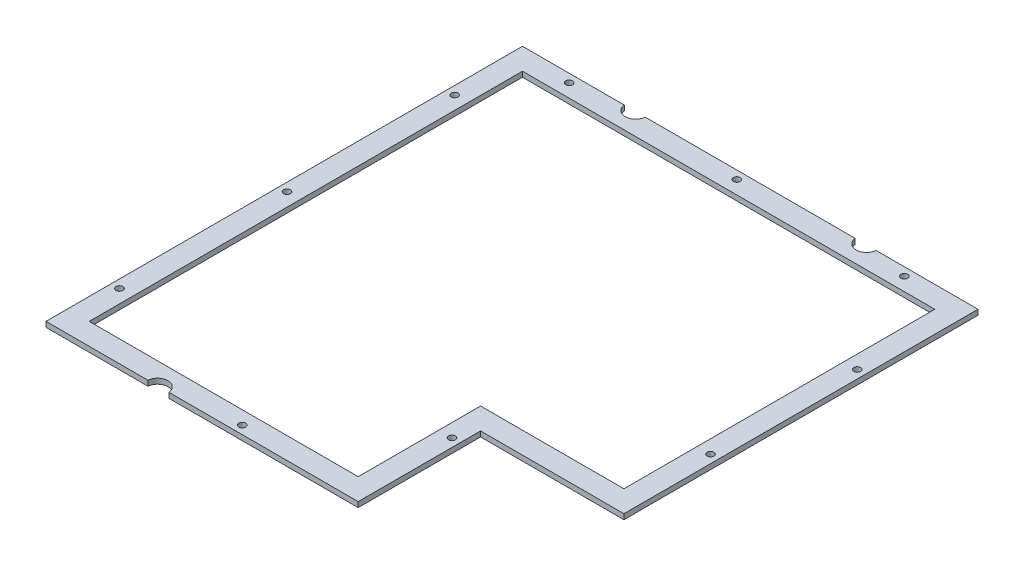
ISO-10303-21;
HEADER;
FILE_DESCRIPTION(('STEP AP214'),'2;1');
FILE_NAME('part.step','',(''),(''),'','','');
FILE_SCHEMA(('AUTOMOTIVE_DESIGN { 1 0 10303 214 1 1 1 1 }'));
ENDSEC;
DATA;
#1=APPLICATION_CONTEXT('core data for automotive mechanical design processes');
#2=APPLICATION_PROTOCOL_DEFINITION('international standard','automotive_design',2000,#1);
#3=PRODUCT_CONTEXT('',#1,'mechanical');
#4=PRODUCT('Part','Part','',(#3));
#5=PRODUCT_RELATED_PRODUCT_CATEGORY('part','',(#4));
#6=PRODUCT_DEFINITION_FORMATION('','',#4);
#7=PRODUCT_DEFINITION_CONTEXT('part definition',#1,'design');
#8=PRODUCT_DEFINITION('design','',#6,#7);
#9=PRODUCT_DEFINITION_SHAPE('','',#8);
#10=(LENGTH_UNIT() NAMED_UNIT(*) SI_UNIT(.MILLI.,.METRE.));
#11=(NAMED_UNIT(*) PLANE_ANGLE_UNIT() SI_UNIT($,.RADIAN.));
#12=(NAMED_UNIT(*) SI_UNIT($,.STERADIAN.) SOLID_ANGLE_UNIT());
#13=UNCERTAINTY_MEASURE_WITH_UNIT(LENGTH_MEASURE(1.E-05),#10,'distance_accuracy_value','');
#14=(GEOMETRIC_REPRESENTATION_CONTEXT(3) GLOBAL_UNCERTAINTY_ASSIGNED_CONTEXT((#13)) GLOBAL_UNIT_ASSIGNED_CONTEXT((#10,
#11,#12)) REPRESENTATION_CONTEXT('',''));
#15=CARTESIAN_POINT('',(0.,0.,0.));
#16=DIRECTION('',(0.,0.,1.));
#17=DIRECTION('',(1.,0.,0.));
#18=AXIS2_PLACEMENT_3D('',#15,#16,#17);
#19=CARTESIAN_POINT('',(-138.1125,3.175,-144.4625));
#20=DIRECTION('',(0.,0.,1.));
#21=DIRECTION('',(1.,0.,0.));
#22=AXIS2_PLACEMENT_3D('',#19,#20,#21);
#23=PLANE('',#22);
#24=DIRECTION('',(-1.,0.,0.));
#25=VECTOR('',#24,1.);
#26=CARTESIAN_POINT('',(-138.1125,0.,-144.4625));
#27=LINE('',#26,#25);
#28=CARTESIAN_POINT('',(138.1125,0.,-144.4625));
#29=VERTEX_POINT('',#28);
#30=CARTESIAN_POINT('',(76.326987254102,0.,-144.4625));
#31=VERTEX_POINT('',#30);
#32=EDGE_CURVE('E175',#29,#31,#27,.T.);
#33=ORIENTED_EDGE('',*,*,#32,.T.);
#34=DIRECTION('',(0.,1.,0.));
#35=VECTOR('',#34,1.);
#36=CARTESIAN_POINT('',(76.326987254102,0.,-144.4625));
#37=LINE('',#36,#35);
#38=CARTESIAN_POINT('',(76.326987254102,3.175,-144.4625));
#39=VERTEX_POINT('',#38);
#40=EDGE_CURVE('E48',#31,#39,#37,.T.);
#41=ORIENTED_EDGE('',*,*,#40,.T.);
#42=DIRECTION('',(-1.,0.,0.));
#43=VECTOR('',#42,1.);
#44=CARTESIAN_POINT('',(-138.1125,3.175,-144.4625));
#45=LINE('',#44,#43);
#46=CARTESIAN_POINT('',(138.1125,3.175,-144.4625));
#47=VERTEX_POINT('',#46);
#48=EDGE_CURVE('E187',#47,#39,#45,.T.);
#49=ORIENTED_EDGE('',*,*,#48,.F.);
#50=DIRECTION('',(0.,-1.,0.));
#51=VECTOR('',#50,1.);
#52=CARTESIAN_POINT('',(138.1125,3.175,-144.4625));
#53=LINE('',#52,#51);
#54=EDGE_CURVE('E186',#47,#29,#53,.T.);
#55=ORIENTED_EDGE('',*,*,#54,.T.);
#56=EDGE_LOOP('',(#33,#41,#49,#55));
#57=FACE_BOUND('',#56,.T.);
#58=ADVANCED_FACE('F34',(#57),#23,.F.);
#59=CARTESIAN_POINT('',(63.672732745898,3.175,-144.4625));
#60=VERTEX_POINT('',#59);
#61=CARTESIAN_POINT('',(-63.672732745898,3.175,-144.4625));
#62=VERTEX_POINT('',#61);
#63=EDGE_CURVE('E169',#60,#62,#45,.T.);
#64=ORIENTED_EDGE('',*,*,#63,.F.);
#65=DIRECTION('',(0.,1.,0.));
#66=VECTOR('',#65,1.);
#67=CARTESIAN_POINT('',(63.672732745898,0.,-144.4625));
#68=LINE('',#67,#66);
#69=CARTESIAN_POINT('',(63.672732745898,0.,-144.4625));
#70=VERTEX_POINT('',#69);
#71=EDGE_CURVE('E158',#60,#70,#68,.F.);
#72=ORIENTED_EDGE('',*,*,#71,.T.);
#73=CARTESIAN_POINT('',(-63.672732745898,0.,-144.4625));
#74=VERTEX_POINT('',#73);
#75=EDGE_CURVE('E168',#70,#74,#27,.T.);
#76=ORIENTED_EDGE('',*,*,#75,.T.);
#77=DIRECTION('',(0.,1.,0.));
#78=VECTOR('',#77,1.);
#79=CARTESIAN_POINT('',(-63.672732745898,0.,-144.4625));
#80=LINE('',#79,#78);
#81=EDGE_CURVE('E42',#74,#62,#80,.T.);
#82=ORIENTED_EDGE('',*,*,#81,.T.);
#83=EDGE_LOOP('',(#64,#72,#76,#82));
#84=FACE_BOUND('',#83,.T.);
#85=ADVANCED_FACE('F166',(#84),#23,.F.);
#86=CARTESIAN_POINT('',(51.1937,3.175,144.4625));
#87=DIRECTION('',(0.,0.,-1.));
#88=DIRECTION('',(-1.,0.,0.));
#89=AXIS2_PLACEMENT_3D('',#86,#87,#88);
#90=PLANE('',#89);
#91=DIRECTION('',(1.,0.,0.));
#92=VECTOR('',#91,1.);
#93=CARTESIAN_POINT('',(51.1937,0.,144.4625));
#94=LINE('',#93,#92);
#95=CARTESIAN_POINT('',(-138.1125,0.,144.4625));
#96=VERTEX_POINT('',#95);
#97=CARTESIAN_POINT('',(-76.326987254102,0.,144.4625));
#98=VERTEX_POINT('',#97);
#99=EDGE_CURVE('E348',#96,#98,#94,.T.);
#100=ORIENTED_EDGE('',*,*,#99,.T.);
#101=DIRECTION('',(0.,1.,0.));
#102=VECTOR('',#101,1.);
#103=CARTESIAN_POINT('',(-76.326987254102,0.,144.4625));
#104=LINE('',#103,#102);
#105=CARTESIAN_POINT('',(-76.326987254102,3.175,144.4625));
#106=VERTEX_POINT('',#105);
#107=EDGE_CURVE('E205',#98,#106,#104,.T.);
#108=ORIENTED_EDGE('',*,*,#107,.T.);
#109=DIRECTION('',(1.,0.,0.));
#110=VECTOR('',#109,1.);
#111=CARTESIAN_POINT('',(51.1937,3.175,144.4625));
#112=LINE('',#111,#110);
#113=CARTESIAN_POINT('',(-138.1125,3.175,144.4625));
#114=VERTEX_POINT('',#113);
#115=EDGE_CURVE('E333',#114,#106,#112,.T.);
#116=ORIENTED_EDGE('',*,*,#115,.F.);
#117=DIRECTION('',(0.,-1.,0.));
#118=VECTOR('',#117,1.);
#119=CARTESIAN_POINT('',(-138.1125,3.175,144.4625));
#120=LINE('',#119,#118);
#121=EDGE_CURVE('E199',#114,#96,#120,.T.);
#122=ORIENTED_EDGE('',*,*,#121,.T.);
#123=EDGE_LOOP('',(#100,#108,#116,#122));
#124=FACE_BOUND('',#123,.T.);
#125=ADVANCED_FACE('F386',(#124),#90,.F.);
#126=CARTESIAN_POINT('',(-138.1125,3.175,-144.4625));
#127=DIRECTION('',(0.,-1.,0.));
#128=DIRECTION('',(0.,0.,-1.));
#129=AXIS2_PLACEMENT_3D('',#126,#127,#128);
#130=PLANE('',#129);
#131=CARTESIAN_POINT('',(46.1772,3.175,82.55));
#132=DIRECTION('',(0.,1.,0.));
#133=DIRECTION('',(0.,0.,1.));
#134=AXIS2_PLACEMENT_3D('',#131,#132,#133);
#135=CIRCLE('',#134,2.0701);
#136=CARTESIAN_POINT('',(46.1772,3.175,84.6201));
#137=VERTEX_POINT('',#136);
#138=EDGE_CURVE('E223',#137,#137,#135,.T.);
#139=ORIENTED_EDGE('',*,*,#138,.F.);
#140=EDGE_LOOP('',(#139));
#141=FACE_BOUND('',#140,.T.);
#142=CARTESIAN_POINT('',(133.096,3.175,12.7));
#143=DIRECTION('',(0.,1.,0.));
#144=DIRECTION('',(0.,0.,1.));
#145=AXIS2_PLACEMENT_3D('',#142,#143,#144);
#146=CIRCLE('',#145,2.07009999999999);
#147=CARTESIAN_POINT('',(133.096,3.175,14.7701));
#148=VERTEX_POINT('',#147);
#149=EDGE_CURVE('E228',#148,#148,#146,.T.);
#150=ORIENTED_EDGE('',*,*,#149,.F.);
#151=EDGE_LOOP('',(#150));
#152=FACE_BOUND('',#151,.T.);
#153=CARTESIAN_POINT('',(133.096,3.175,-76.2));
#154=DIRECTION('',(0.,1.,0.));
#155=DIRECTION('',(0.,0.,1.));
#156=AXIS2_PLACEMENT_3D('',#153,#154,#155);
#157=CIRCLE('',#156,2.07009999999999);
#158=CARTESIAN_POINT('',(133.096,3.175,-74.1299));
#159=VERTEX_POINT('',#158);
#160=EDGE_CURVE('E234',#159,#159,#157,.T.);
#161=ORIENTED_EDGE('',*,*,#160,.F.);
#162=EDGE_LOOP('',(#161));
#163=FACE_BOUND('',#162,.T.);
#164=CARTESIAN_POINT('',(98.425,3.175,-139.446));
#165=DIRECTION('',(0.,1.,0.));
#166=DIRECTION('',(0.,0.,1.));
#167=AXIS2_PLACEMENT_3D('',#164,#165,#166);
#168=CIRCLE('',#167,2.07010000000001);
#169=CARTESIAN_POINT('',(98.425,3.175,-137.3759));
#170=VERTEX_POINT('',#169);
#171=EDGE_CURVE('E240',#170,#170,#168,.T.);
#172=ORIENTED_EDGE('',*,*,#171,.F.);
#173=EDGE_LOOP('',(#172));
#174=FACE_BOUND('',#173,.T.);
#175=CARTESIAN_POINT('',(-133.096,3.175,-98.2634306));
#176=DIRECTION('',(0.,1.,0.));
#177=DIRECTION('',(0.,0.,1.));
#178=AXIS2_PLACEMENT_3D('',#175,#176,#177);
#179=CIRCLE('',#178,2.07009999999999);
#180=CARTESIAN_POINT('',(-133.096,3.175,-96.1933306));
#181=VERTEX_POINT('',#180);
#182=EDGE_CURVE('E246',#181,#181,#179,.T.);
#183=ORIENTED_EDGE('',*,*,#182,.F.);
#184=EDGE_LOOP('',(#183));
#185=FACE_BOUND('',#184,.T.);
#186=CARTESIAN_POINT('',(-133.096,3.175,3.33656939999999));
#187=DIRECTION('',(0.,1.,0.));
#188=DIRECTION('',(0.,0.,1.));
#189=AXIS2_PLACEMENT_3D('',#186,#187,#188);
#190=CIRCLE('',#189,2.07009999999999);
#191=CARTESIAN_POINT('',(-133.096,3.175,5.40666939999998));
#192=VERTEX_POINT('',#191);
#193=EDGE_CURVE('E252',#192,#192,#190,.T.);
#194=ORIENTED_EDGE('',*,*,#193,.F.);
#195=EDGE_LOOP('',(#194));
#196=FACE_BOUND('',#195,.T.);
#197=CARTESIAN_POINT('',(-133.096,3.175,104.9365694));
#198=DIRECTION('',(0.,1.,0.));
#199=DIRECTION('',(0.,0.,1.));
#200=AXIS2_PLACEMENT_3D('',#197,#198,#199);
#201=CIRCLE('',#200,2.07009999999999);
#202=CARTESIAN_POINT('',(-133.096,3.175,107.0066694));
#203=VERTEX_POINT('',#202);
#204=EDGE_CURVE('E258',#203,#203,#201,.T.);
#205=ORIENTED_EDGE('',*,*,#204,.F.);
#206=EDGE_LOOP('',(#205));
#207=FACE_BOUND('',#206,.T.);
#208=CARTESIAN_POINT('',(-3.175,3.175,-139.446));
#209=DIRECTION('',(0.,1.,0.));
#210=DIRECTION('',(0.,0.,1.));
#211=AXIS2_PLACEMENT_3D('',#208,#209,#210);
#212=CIRCLE('',#211,2.0701);
#213=CARTESIAN_POINT('',(-3.175,3.175,-137.3759));
#214=VERTEX_POINT('',#213);
#215=EDGE_CURVE('E264',#214,#214,#212,.T.);
#216=ORIENTED_EDGE('',*,*,#215,.F.);
#217=EDGE_LOOP('',(#216));
#218=FACE_BOUND('',#217,.T.);
#219=CARTESIAN_POINT('',(-104.775,3.175,-139.446));
#220=DIRECTION('',(0.,1.,0.));
#221=DIRECTION('',(0.,0.,1.));
#222=AXIS2_PLACEMENT_3D('',#219,#220,#221);
#223=CIRCLE('',#222,2.07010000000001);
#224=CARTESIAN_POINT('',(-104.775,3.175,-137.3759));
#225=VERTEX_POINT('',#224);
#226=EDGE_CURVE('E270',#225,#225,#223,.T.);
#227=ORIENTED_EDGE('',*,*,#226,.F.);
#228=EDGE_LOOP('',(#227));
#229=FACE_BOUND('',#228,.T.);
#230=CARTESIAN_POINT('',(-24.13,3.175,139.446));
#231=DIRECTION('',(0.,1.,0.));
#232=DIRECTION('',(0.,0.,1.));
#233=AXIS2_PLACEMENT_3D('',#230,#231,#232);
#234=CIRCLE('',#233,2.0701);
#235=CARTESIAN_POINT('',(-24.13,3.175,141.5161));
#236=VERTEX_POINT('',#235);
#237=EDGE_CURVE('E276',#236,#236,#234,.T.);
#238=ORIENTED_EDGE('',*,*,#237,.F.);
#239=EDGE_LOOP('',(#238));
#240=FACE_BOUND('',#239,.T.);
#241=ORIENTED_EDGE('',*,*,#48,.T.);
#242=CARTESIAN_POINT('',(69.99986,3.175,-145.00098));
#243=DIRECTION('',(0.,1.,0.));
#244=DIRECTION('',(0.,0.,1.));
#245=AXIS2_PLACEMENT_3D('',#242,#243,#244);
#246=CIRCLE('',#245,6.34999999999999);
#247=EDGE_CURVE('E170',#60,#39,#246,.T.);
#248=ORIENTED_EDGE('',*,*,#247,.F.);
#249=ORIENTED_EDGE('',*,*,#63,.T.);
#250=CARTESIAN_POINT('',(-69.99986,3.175,-145.00098));
#251=DIRECTION('',(0.,1.,0.));
#252=DIRECTION('',(0.,0.,1.));
#253=AXIS2_PLACEMENT_3D('',#250,#251,#252);
#254=CIRCLE('',#253,6.34999999999999);
#255=CARTESIAN_POINT('',(-76.326987254102,3.175,-144.4625));
#256=VERTEX_POINT('',#255);
#257=EDGE_CURVE('E212',#256,#62,#254,.T.);
#258=ORIENTED_EDGE('',*,*,#257,.F.);
#259=CARTESIAN_POINT('',(-138.1125,3.175,-144.4625));
#260=VERTEX_POINT('',#259);
#261=EDGE_CURVE('E342',#256,#260,#45,.T.);
#262=ORIENTED_EDGE('',*,*,#261,.T.);
#263=DIRECTION('',(0.,0.,1.));
#264=VECTOR('',#263,1.);
#265=CARTESIAN_POINT('',(-138.1125,3.175,144.4625));
#266=LINE('',#265,#264);
#267=EDGE_CURVE('E178',#260,#114,#266,.T.);
#268=ORIENTED_EDGE('',*,*,#267,.T.);
#269=ORIENTED_EDGE('',*,*,#115,.T.);
#270=CARTESIAN_POINT('',(-69.99986,3.175,145.00098));
#271=DIRECTION('',(0.,1.,0.));
#272=DIRECTION('',(0.,0.,1.));
#273=AXIS2_PLACEMENT_3D('',#270,#271,#272);
#274=CIRCLE('',#273,6.34999999999999);
#275=CARTESIAN_POINT('',(-63.672732745898,3.175,144.4625));
#276=VERTEX_POINT('',#275);
#277=EDGE_CURVE('E216',#276,#106,#274,.T.);
#278=ORIENTED_EDGE('',*,*,#277,.F.);
#279=CARTESIAN_POINT('',(51.1937,3.175,144.4625));
#280=VERTEX_POINT('',#279);
#281=EDGE_CURVE('E332',#276,#280,#112,.T.);
#282=ORIENTED_EDGE('',*,*,#281,.T.);
#283=DIRECTION('',(0.,0.,-1.));
#284=VECTOR('',#283,1.);
#285=CARTESIAN_POINT('',(51.1937,3.175,70.2437));
#286=LINE('',#285,#284);
#287=CARTESIAN_POINT('',(51.1937,3.175,70.2437));
#288=VERTEX_POINT('',#287);
#289=EDGE_CURVE('E336',#280,#288,#286,.T.);
#290=ORIENTED_EDGE('',*,*,#289,.T.);
#291=DIRECTION('',(1.,0.,0.));
#292=VECTOR('',#291,1.);
#293=CARTESIAN_POINT('',(138.1125,3.175,70.2437));
#294=LINE('',#293,#292);
#295=CARTESIAN_POINT('',(138.1125,3.175,70.2437));
#296=VERTEX_POINT('',#295);
#297=EDGE_CURVE('E338',#288,#296,#294,.T.);
#298=ORIENTED_EDGE('',*,*,#297,.T.);
#299=DIRECTION('',(0.,0.,-1.));
#300=VECTOR('',#299,1.);
#301=CARTESIAN_POINT('',(138.1125,3.175,-144.4625));
#302=LINE('',#301,#300);
#303=EDGE_CURVE('E340',#296,#47,#302,.T.);
#304=ORIENTED_EDGE('',*,*,#303,.T.);
#305=EDGE_LOOP('',(#241,#248,#249,#258,#262,#268,#269,#278,#282,#290,#298,#304));
#306=FACE_BOUND('',#305,.T.);
#307=DIRECTION('',(0.,0.,1.));
#308=VECTOR('',#307,1.);
#309=CARTESIAN_POINT('',(-125.0188,3.175,131.3688));
#310=LINE('',#309,#308);
#311=CARTESIAN_POINT('',(-125.0188,3.175,-131.3688));
#312=VERTEX_POINT('',#311);
#313=CARTESIAN_POINT('',(-125.0188,3.175,131.3688));
#314=VERTEX_POINT('',#313);
#315=EDGE_CURVE('E285',#312,#314,#310,.T.);
#316=ORIENTED_EDGE('',*,*,#315,.F.);
#317=DIRECTION('',(-1.,0.,0.));
#318=VECTOR('',#317,1.);
#319=CARTESIAN_POINT('',(-125.0188,3.175,-131.3688));
#320=LINE('',#319,#318);
#321=CARTESIAN_POINT('',(125.0188,3.175,-131.3688));
#322=VERTEX_POINT('',#321);
#323=EDGE_CURVE('E297',#322,#312,#320,.T.);
#324=ORIENTED_EDGE('',*,*,#323,.F.);
#325=DIRECTION('',(0.,0.,-1.));
#326=VECTOR('',#325,1.);
#327=CARTESIAN_POINT('',(125.0188,3.175,-131.3688));
#328=LINE('',#327,#326);
#329=CARTESIAN_POINT('',(125.0188,3.175,57.15));
#330=VERTEX_POINT('',#329);
#331=EDGE_CURVE('E294',#330,#322,#328,.T.);
#332=ORIENTED_EDGE('',*,*,#331,.F.);
#333=DIRECTION('',(1.,0.,0.));
#334=VECTOR('',#333,1.);
#335=CARTESIAN_POINT('',(125.0188,3.175,57.15));
#336=LINE('',#335,#334);
#337=CARTESIAN_POINT('',(38.1,3.175,57.15));
#338=VERTEX_POINT('',#337);
#339=EDGE_CURVE('E292',#338,#330,#336,.T.);
#340=ORIENTED_EDGE('',*,*,#339,.F.);
#341=DIRECTION('',(0.,0.,-1.));
#342=VECTOR('',#341,1.);
#343=CARTESIAN_POINT('',(38.1,3.175,57.15));
#344=LINE('',#343,#342);
#345=CARTESIAN_POINT('',(38.1,3.175,131.3688));
#346=VERTEX_POINT('',#345);
#347=EDGE_CURVE('E290',#346,#338,#344,.T.);
#348=ORIENTED_EDGE('',*,*,#347,.F.);
#349=DIRECTION('',(1.,0.,0.));
#350=VECTOR('',#349,1.);
#351=CARTESIAN_POINT('',(38.1,3.175,131.3688));
#352=LINE('',#351,#350);
#353=EDGE_CURVE('E287',#314,#346,#352,.T.);
#354=ORIENTED_EDGE('',*,*,#353,.F.);
#355=EDGE_LOOP('',(#316,#324,#332,#340,#348,#354));
#356=FACE_BOUND('',#355,.T.);
#357=ADVANCED_FACE('F363',(#141,#152,#163,#174,#185,#196,#207,#218,#229,#240,#306,#356),#130,.F.);
#358=CARTESIAN_POINT('',(-138.1125,0.,-144.4625));
#359=DIRECTION('',(0.,-1.,0.));
#360=DIRECTION('',(0.,0.,-1.));
#361=AXIS2_PLACEMENT_3D('',#358,#359,#360);
#362=PLANE('',#361);
#363=CARTESIAN_POINT('',(69.99986,0.,-145.00098));
#364=DIRECTION('',(0.,-1.,0.));
#365=DIRECTION('',(0.,0.,-1.));
#366=AXIS2_PLACEMENT_3D('',#363,#364,#365);
#367=CIRCLE('',#366,6.34999999999999);
#368=EDGE_CURVE('E11',#31,#70,#367,.T.);
#369=ORIENTED_EDGE('',*,*,#368,.F.);
#370=ORIENTED_EDGE('',*,*,#32,.F.);
#371=DIRECTION('',(0.,0.,-1.));
#372=VECTOR('',#371,1.);
#373=CARTESIAN_POINT('',(138.1125,0.,-144.4625));
#374=LINE('',#373,#372);
#375=CARTESIAN_POINT('',(138.1125,0.,70.2437));
#376=VERTEX_POINT('',#375);
#377=EDGE_CURVE('E179',#376,#29,#374,.T.);
#378=ORIENTED_EDGE('',*,*,#377,.F.);
#379=DIRECTION('',(1.,0.,0.));
#380=VECTOR('',#379,1.);
#381=CARTESIAN_POINT('',(138.1125,0.,70.2437));
#382=LINE('',#381,#380);
#383=CARTESIAN_POINT('',(51.1937,0.,70.2437));
#384=VERTEX_POINT('',#383);
#385=EDGE_CURVE('E352',#384,#376,#382,.T.);
#386=ORIENTED_EDGE('',*,*,#385,.F.);
#387=DIRECTION('',(0.,0.,-1.));
#388=VECTOR('',#387,1.);
#389=CARTESIAN_POINT('',(51.1937,0.,70.2437));
#390=LINE('',#389,#388);
#391=CARTESIAN_POINT('',(51.1937,0.,144.4625));
#392=VERTEX_POINT('',#391);
#393=EDGE_CURVE('E351',#392,#384,#390,.T.);
#394=ORIENTED_EDGE('',*,*,#393,.F.);
#395=CARTESIAN_POINT('',(-63.672732745898,0.,144.4625));
#396=VERTEX_POINT('',#395);
#397=EDGE_CURVE('E347',#396,#392,#94,.T.);
#398=ORIENTED_EDGE('',*,*,#397,.F.);
#399=CARTESIAN_POINT('',(-69.99986,0.,145.00098));
#400=DIRECTION('',(0.,1.,0.));
#401=DIRECTION('',(0.,0.,1.));
#402=AXIS2_PLACEMENT_3D('',#399,#400,#401);
#403=CIRCLE('',#402,6.34999999999999);
#404=EDGE_CURVE('E220',#396,#98,#403,.T.);
#405=ORIENTED_EDGE('',*,*,#404,.T.);
#406=ORIENTED_EDGE('',*,*,#99,.F.);
#407=DIRECTION('',(0.,0.,1.));
#408=VECTOR('',#407,1.);
#409=CARTESIAN_POINT('',(-138.1125,0.,144.4625));
#410=LINE('',#409,#408);
#411=CARTESIAN_POINT('',(-138.1125,0.,-144.4625));
#412=VERTEX_POINT('',#411);
#413=EDGE_CURVE('E329',#412,#96,#410,.T.);
#414=ORIENTED_EDGE('',*,*,#413,.F.);
#415=CARTESIAN_POINT('',(-76.326987254102,0.,-144.4625));
#416=VERTEX_POINT('',#415);
#417=EDGE_CURVE('E176',#416,#412,#27,.T.);
#418=ORIENTED_EDGE('',*,*,#417,.F.);
#419=CARTESIAN_POINT('',(-69.99986,0.,-145.00098));
#420=DIRECTION('',(0.,1.,0.));
#421=DIRECTION('',(0.,0.,1.));
#422=AXIS2_PLACEMENT_3D('',#419,#420,#421);
#423=CIRCLE('',#422,6.34999999999999);
#424=EDGE_CURVE('E56',#416,#74,#423,.T.);
#425=ORIENTED_EDGE('',*,*,#424,.T.);
#426=ORIENTED_EDGE('',*,*,#75,.F.);
#427=EDGE_LOOP('',(#369,#370,#378,#386,#394,#398,#405,#406,#414,#418,#425,#426));
#428=FACE_BOUND('',#427,.T.);
#429=CARTESIAN_POINT('',(46.1772,0.,82.55));
#430=DIRECTION('',(0.,1.,0.));
#431=DIRECTION('',(0.,0.,1.));
#432=AXIS2_PLACEMENT_3D('',#429,#430,#431);
#433=CIRCLE('',#432,2.0701);
#434=CARTESIAN_POINT('',(46.1772,0.,84.6201));
#435=VERTEX_POINT('',#434);
#436=EDGE_CURVE('E225',#435,#435,#433,.T.);
#437=ORIENTED_EDGE('',*,*,#436,.T.);
#438=EDGE_LOOP('',(#437));
#439=FACE_BOUND('',#438,.T.);
#440=CARTESIAN_POINT('',(133.096,0.,12.7));
#441=DIRECTION('',(0.,1.,0.));
#442=DIRECTION('',(0.,0.,1.));
#443=AXIS2_PLACEMENT_3D('',#440,#441,#442);
#444=CIRCLE('',#443,2.07009999999999);
#445=CARTESIAN_POINT('',(133.096,0.,14.7701));
#446=VERTEX_POINT('',#445);
#447=EDGE_CURVE('E231',#446,#446,#444,.T.);
#448=ORIENTED_EDGE('',*,*,#447,.T.);
#449=EDGE_LOOP('',(#448));
#450=FACE_BOUND('',#449,.T.);
#451=CARTESIAN_POINT('',(133.096,0.,-76.2));
#452=DIRECTION('',(0.,1.,0.));
#453=DIRECTION('',(0.,0.,1.));
#454=AXIS2_PLACEMENT_3D('',#451,#452,#453);
#455=CIRCLE('',#454,2.07009999999999);
#456=CARTESIAN_POINT('',(133.096,0.,-74.1299));
#457=VERTEX_POINT('',#456);
#458=EDGE_CURVE('E237',#457,#457,#455,.T.);
#459=ORIENTED_EDGE('',*,*,#458,.T.);
#460=EDGE_LOOP('',(#459));
#461=FACE_BOUND('',#460,.T.);
#462=CARTESIAN_POINT('',(98.425,0.,-139.446));
#463=DIRECTION('',(0.,1.,0.));
#464=DIRECTION('',(0.,0.,1.));
#465=AXIS2_PLACEMENT_3D('',#462,#463,#464);
#466=CIRCLE('',#465,2.07010000000001);
#467=CARTESIAN_POINT('',(98.425,0.,-137.3759));
#468=VERTEX_POINT('',#467);
#469=EDGE_CURVE('E243',#468,#468,#466,.T.);
#470=ORIENTED_EDGE('',*,*,#469,.T.);
#471=EDGE_LOOP('',(#470));
#472=FACE_BOUND('',#471,.T.);
#473=CARTESIAN_POINT('',(-133.096,0.,-98.2634306));
#474=DIRECTION('',(0.,1.,0.));
#475=DIRECTION('',(0.,0.,1.));
#476=AXIS2_PLACEMENT_3D('',#473,#474,#475);
#477=CIRCLE('',#476,2.07009999999999);
#478=CARTESIAN_POINT('',(-133.096,0.,-96.1933306));
#479=VERTEX_POINT('',#478);
#480=EDGE_CURVE('E249',#479,#479,#477,.T.);
#481=ORIENTED_EDGE('',*,*,#480,.T.);
#482=EDGE_LOOP('',(#481));
#483=FACE_BOUND('',#482,.T.);
#484=CARTESIAN_POINT('',(-133.096,0.,3.33656939999999));
#485=DIRECTION('',(0.,1.,0.));
#486=DIRECTION('',(0.,0.,1.));
#487=AXIS2_PLACEMENT_3D('',#484,#485,#486);
#488=CIRCLE('',#487,2.07009999999999);
#489=CARTESIAN_POINT('',(-133.096,0.,5.40666939999998));
#490=VERTEX_POINT('',#489);
#491=EDGE_CURVE('E255',#490,#490,#488,.T.);
#492=ORIENTED_EDGE('',*,*,#491,.T.);
#493=EDGE_LOOP('',(#492));
#494=FACE_BOUND('',#493,.T.);
#495=CARTESIAN_POINT('',(-133.096,0.,104.9365694));
#496=DIRECTION('',(0.,1.,0.));
#497=DIRECTION('',(0.,0.,1.));
#498=AXIS2_PLACEMENT_3D('',#495,#496,#497);
#499=CIRCLE('',#498,2.07009999999999);
#500=CARTESIAN_POINT('',(-133.096,0.,107.0066694));
#501=VERTEX_POINT('',#500);
#502=EDGE_CURVE('E261',#501,#501,#499,.T.);
#503=ORIENTED_EDGE('',*,*,#502,.T.);
#504=EDGE_LOOP('',(#503));
#505=FACE_BOUND('',#504,.T.);
#506=CARTESIAN_POINT('',(-3.175,0.,-139.446));
#507=DIRECTION('',(0.,1.,0.));
#508=DIRECTION('',(0.,0.,1.));
#509=AXIS2_PLACEMENT_3D('',#506,#507,#508);
#510=CIRCLE('',#509,2.0701);
#511=CARTESIAN_POINT('',(-3.175,0.,-137.3759));
#512=VERTEX_POINT('',#511);
#513=EDGE_CURVE('E267',#512,#512,#510,.T.);
#514=ORIENTED_EDGE('',*,*,#513,.T.);
#515=EDGE_LOOP('',(#514));
#516=FACE_BOUND('',#515,.T.);
#517=CARTESIAN_POINT('',(-104.775,0.,-139.446));
#518=DIRECTION('',(0.,1.,0.));
#519=DIRECTION('',(0.,0.,1.));
#520=AXIS2_PLACEMENT_3D('',#517,#518,#519);
#521=CIRCLE('',#520,2.07010000000001);
#522=CARTESIAN_POINT('',(-104.775,0.,-137.3759));
#523=VERTEX_POINT('',#522);
#524=EDGE_CURVE('E273',#523,#523,#521,.T.);
#525=ORIENTED_EDGE('',*,*,#524,.T.);
#526=EDGE_LOOP('',(#525));
#527=FACE_BOUND('',#526,.T.);
#528=CARTESIAN_POINT('',(-24.13,0.,139.446));
#529=DIRECTION('',(0.,1.,0.));
#530=DIRECTION('',(0.,0.,1.));
#531=AXIS2_PLACEMENT_3D('',#528,#529,#530);
#532=CIRCLE('',#531,2.0701);
#533=CARTESIAN_POINT('',(-24.13,0.,141.5161));
#534=VERTEX_POINT('',#533);
#535=EDGE_CURVE('E279',#534,#534,#532,.T.);
#536=ORIENTED_EDGE('',*,*,#535,.T.);
#537=EDGE_LOOP('',(#536));
#538=FACE_BOUND('',#537,.T.);
#539=DIRECTION('',(-1.,0.,0.));
#540=VECTOR('',#539,1.);
#541=CARTESIAN_POINT('',(-125.0188,0.,-131.3688));
#542=LINE('',#541,#540);
#543=CARTESIAN_POINT('',(125.0188,0.,-131.3688));
#544=VERTEX_POINT('',#543);
#545=CARTESIAN_POINT('',(-125.0188,0.,-131.3688));
#546=VERTEX_POINT('',#545);
#547=EDGE_CURVE('E288',#544,#546,#542,.T.);
#548=ORIENTED_EDGE('',*,*,#547,.T.);
#549=DIRECTION('',(0.,0.,1.));
#550=VECTOR('',#549,1.);
#551=CARTESIAN_POINT('',(-125.0188,0.,131.3688));
#552=LINE('',#551,#550);
#553=CARTESIAN_POINT('',(-125.0188,0.,131.3688));
#554=VERTEX_POINT('',#553);
#555=EDGE_CURVE('E282',#546,#554,#552,.T.);
#556=ORIENTED_EDGE('',*,*,#555,.T.);
#557=DIRECTION('',(1.,0.,0.));
#558=VECTOR('',#557,1.);
#559=CARTESIAN_POINT('',(38.1,0.,131.3688));
#560=LINE('',#559,#558);
#561=CARTESIAN_POINT('',(38.1,0.,131.3688));
#562=VERTEX_POINT('',#561);
#563=EDGE_CURVE('E302',#554,#562,#560,.T.);
#564=ORIENTED_EDGE('',*,*,#563,.T.);
#565=DIRECTION('',(0.,0.,-1.));
#566=VECTOR('',#565,1.);
#567=CARTESIAN_POINT('',(38.1,0.,57.15));
#568=LINE('',#567,#566);
#569=CARTESIAN_POINT('',(38.1,0.,57.15));
#570=VERTEX_POINT('',#569);
#571=EDGE_CURVE('E305',#562,#570,#568,.T.);
#572=ORIENTED_EDGE('',*,*,#571,.T.);
#573=DIRECTION('',(1.,0.,0.));
#574=VECTOR('',#573,1.);
#575=CARTESIAN_POINT('',(125.0188,0.,57.15));
#576=LINE('',#575,#574);
#577=CARTESIAN_POINT('',(125.0188,0.,57.15));
#578=VERTEX_POINT('',#577);
#579=EDGE_CURVE('E308',#570,#578,#576,.T.);
#580=ORIENTED_EDGE('',*,*,#579,.T.);
#581=DIRECTION('',(0.,0.,-1.));
#582=VECTOR('',#581,1.);
#583=CARTESIAN_POINT('',(125.0188,0.,-131.3688));
#584=LINE('',#583,#582);
#585=EDGE_CURVE('E311',#578,#544,#584,.T.);
#586=ORIENTED_EDGE('',*,*,#585,.T.);
#587=EDGE_LOOP('',(#548,#556,#564,#572,#580,#586));
#588=FACE_BOUND('',#587,.T.);
#589=ADVANCED_FACE('F172',(#428,#439,#450,#461,#472,#483,#494,#505,#516,#527,#538,#588),#362,.T.);
#590=CARTESIAN_POINT('',(-138.1125,3.175,144.4625));
#591=DIRECTION('',(1.,0.,0.));
#592=DIRECTION('',(0.,0.,-1.));
#593=AXIS2_PLACEMENT_3D('',#590,#591,#592);
#594=PLANE('',#593);
#595=ORIENTED_EDGE('',*,*,#413,.T.);
#596=ORIENTED_EDGE('',*,*,#121,.F.);
#597=ORIENTED_EDGE('',*,*,#267,.F.);
#598=DIRECTION('',(0.,-1.,0.));
#599=VECTOR('',#598,1.);
#600=CARTESIAN_POINT('',(-138.1125,3.175,-144.4625));
#601=LINE('',#600,#599);
#602=EDGE_CURVE('E183',#260,#412,#601,.T.);
#603=ORIENTED_EDGE('',*,*,#602,.T.);
#604=EDGE_LOOP('',(#595,#596,#597,#603));
#605=FACE_BOUND('',#604,.T.);
#606=ADVANCED_FACE('F36',(#605),#594,.F.);
#607=ORIENTED_EDGE('',*,*,#281,.F.);
#608=DIRECTION('',(0.,1.,0.));
#609=VECTOR('',#608,1.);
#610=CARTESIAN_POINT('',(-63.672732745898,0.,144.4625));
#611=LINE('',#610,#609);
#612=EDGE_CURVE('E202',#276,#396,#611,.F.);
#613=ORIENTED_EDGE('',*,*,#612,.T.);
#614=ORIENTED_EDGE('',*,*,#397,.T.);
#615=DIRECTION('',(0.,-1.,0.));
#616=VECTOR('',#615,1.);
#617=CARTESIAN_POINT('',(51.1937,3.175,144.4625));
#618=LINE('',#617,#616);
#619=EDGE_CURVE('E196',#280,#392,#618,.T.);
#620=ORIENTED_EDGE('',*,*,#619,.F.);
#621=EDGE_LOOP('',(#607,#613,#614,#620));
#622=FACE_BOUND('',#621,.T.);
#623=ADVANCED_FACE('F378',(#622),#90,.F.);
#624=CARTESIAN_POINT('',(51.1937,3.175,70.2437));
#625=DIRECTION('',(-1.,0.,0.));
#626=DIRECTION('',(0.,0.,1.));
#627=AXIS2_PLACEMENT_3D('',#624,#625,#626);
#628=PLANE('',#627);
#629=ORIENTED_EDGE('',*,*,#393,.T.);
#630=DIRECTION('',(0.,-1.,0.));
#631=VECTOR('',#630,1.);
#632=CARTESIAN_POINT('',(51.1937,3.175,70.2437));
#633=LINE('',#632,#631);
#634=EDGE_CURVE('E193',#288,#384,#633,.T.);
#635=ORIENTED_EDGE('',*,*,#634,.F.);
#636=ORIENTED_EDGE('',*,*,#289,.F.);
#637=ORIENTED_EDGE('',*,*,#619,.T.);
#638=EDGE_LOOP('',(#629,#635,#636,#637));
#639=FACE_BOUND('',#638,.T.);
#640=ADVANCED_FACE('F370',(#639),#628,.F.);
#641=CARTESIAN_POINT('',(138.1125,3.175,70.2437));
#642=DIRECTION('',(0.,0.,-1.));
#643=DIRECTION('',(-1.,0.,0.));
#644=AXIS2_PLACEMENT_3D('',#641,#642,#643);
#645=PLANE('',#644);
#646=ORIENTED_EDGE('',*,*,#385,.T.);
#647=DIRECTION('',(0.,-1.,0.));
#648=VECTOR('',#647,1.);
#649=CARTESIAN_POINT('',(138.1125,3.175,70.2437));
#650=LINE('',#649,#648);
#651=EDGE_CURVE('E190',#296,#376,#650,.T.);
#652=ORIENTED_EDGE('',*,*,#651,.F.);
#653=ORIENTED_EDGE('',*,*,#297,.F.);
#654=ORIENTED_EDGE('',*,*,#634,.T.);
#655=EDGE_LOOP('',(#646,#652,#653,#654));
#656=FACE_BOUND('',#655,.T.);
#657=ADVANCED_FACE('F368',(#656),#645,.F.);
#658=CARTESIAN_POINT('',(138.1125,3.175,-144.4625));
#659=DIRECTION('',(-1.,0.,0.));
#660=DIRECTION('',(0.,0.,1.));
#661=AXIS2_PLACEMENT_3D('',#658,#659,#660);
#662=PLANE('',#661);
#663=ORIENTED_EDGE('',*,*,#377,.T.);
#664=ORIENTED_EDGE('',*,*,#54,.F.);
#665=ORIENTED_EDGE('',*,*,#303,.F.);
#666=ORIENTED_EDGE('',*,*,#651,.T.);
#667=EDGE_LOOP('',(#663,#664,#665,#666));
#668=FACE_BOUND('',#667,.T.);
#669=ADVANCED_FACE('F359',(#668),#662,.F.);
#670=ORIENTED_EDGE('',*,*,#261,.F.);
#671=DIRECTION('',(0.,1.,0.));
#672=VECTOR('',#671,1.);
#673=CARTESIAN_POINT('',(-76.326987254102,0.,-144.4625));
#674=LINE('',#673,#672);
#675=EDGE_CURVE('E208',#256,#416,#674,.F.);
#676=ORIENTED_EDGE('',*,*,#675,.T.);
#677=ORIENTED_EDGE('',*,*,#417,.T.);
#678=ORIENTED_EDGE('',*,*,#602,.F.);
#679=EDGE_LOOP('',(#670,#676,#677,#678));
#680=FACE_BOUND('',#679,.T.);
#681=ADVANCED_FACE('F376',(#680),#23,.F.);
#682=CARTESIAN_POINT('',(-125.0188,3.175,131.3688));
#683=DIRECTION('',(1.,0.,0.));
#684=DIRECTION('',(0.,0.,-1.));
#685=AXIS2_PLACEMENT_3D('',#682,#683,#684);
#686=PLANE('',#685);
#687=ORIENTED_EDGE('',*,*,#555,.F.);
#688=DIRECTION('',(0.,-1.,0.));
#689=VECTOR('',#688,1.);
#690=CARTESIAN_POINT('',(-125.0188,3.175,-131.3688));
#691=LINE('',#690,#689);
#692=EDGE_CURVE('E299',#312,#546,#691,.T.);
#693=ORIENTED_EDGE('',*,*,#692,.F.);
#694=ORIENTED_EDGE('',*,*,#315,.T.);
#695=DIRECTION('',(0.,-1.,0.));
#696=VECTOR('',#695,1.);
#697=CARTESIAN_POINT('',(-125.0188,3.175,131.3688));
#698=LINE('',#697,#696);
#699=EDGE_CURVE('E326',#314,#554,#698,.T.);
#700=ORIENTED_EDGE('',*,*,#699,.T.);
#701=EDGE_LOOP('',(#687,#693,#694,#700));
#702=FACE_BOUND('',#701,.T.);
#703=ADVANCED_FACE('F389',(#702),#686,.T.);
#704=CARTESIAN_POINT('',(38.1,3.175,131.3688));
#705=DIRECTION('',(0.,0.,-1.));
#706=DIRECTION('',(-1.,0.,0.));
#707=AXIS2_PLACEMENT_3D('',#704,#705,#706);
#708=PLANE('',#707);
#709=ORIENTED_EDGE('',*,*,#563,.F.);
#710=ORIENTED_EDGE('',*,*,#699,.F.);
#711=ORIENTED_EDGE('',*,*,#353,.T.);
#712=DIRECTION('',(0.,-1.,0.));
#713=VECTOR('',#712,1.);
#714=CARTESIAN_POINT('',(38.1,3.175,131.3688));
#715=LINE('',#714,#713);
#716=EDGE_CURVE('E324',#346,#562,#715,.T.);
#717=ORIENTED_EDGE('',*,*,#716,.T.);
#718=EDGE_LOOP('',(#709,#710,#711,#717));
#719=FACE_BOUND('',#718,.T.);
#720=ADVANCED_FACE('F394',(#719),#708,.T.);
#721=CARTESIAN_POINT('',(38.1,3.175,57.15));
#722=DIRECTION('',(-1.,0.,0.));
#723=DIRECTION('',(0.,0.,1.));
#724=AXIS2_PLACEMENT_3D('',#721,#722,#723);
#725=PLANE('',#724);
#726=ORIENTED_EDGE('',*,*,#571,.F.);
#727=ORIENTED_EDGE('',*,*,#716,.F.);
#728=ORIENTED_EDGE('',*,*,#347,.T.);
#729=DIRECTION('',(0.,-1.,0.));
#730=VECTOR('',#729,1.);
#731=CARTESIAN_POINT('',(38.1,3.175,57.15));
#732=LINE('',#731,#730);
#733=EDGE_CURVE('E322',#338,#570,#732,.T.);
#734=ORIENTED_EDGE('',*,*,#733,.T.);
#735=EDGE_LOOP('',(#726,#727,#728,#734));
#736=FACE_BOUND('',#735,.T.);
#737=ADVANCED_FACE('F429',(#736),#725,.T.);
#738=CARTESIAN_POINT('',(125.0188,3.175,57.15));
#739=DIRECTION('',(0.,0.,-1.));
#740=DIRECTION('',(-1.,0.,0.));
#741=AXIS2_PLACEMENT_3D('',#738,#739,#740);
#742=PLANE('',#741);
#743=ORIENTED_EDGE('',*,*,#579,.F.);
#744=ORIENTED_EDGE('',*,*,#733,.F.);
#745=ORIENTED_EDGE('',*,*,#339,.T.);
#746=DIRECTION('',(0.,-1.,0.));
#747=VECTOR('',#746,1.);
#748=CARTESIAN_POINT('',(125.0188,3.175,57.15));
#749=LINE('',#748,#747);
#750=EDGE_CURVE('E320',#330,#578,#749,.T.);
#751=ORIENTED_EDGE('',*,*,#750,.T.);
#752=EDGE_LOOP('',(#743,#744,#745,#751));
#753=FACE_BOUND('',#752,.T.);
#754=ADVANCED_FACE('F433',(#753),#742,.T.);
#755=CARTESIAN_POINT('',(125.0188,3.175,-131.3688));
#756=DIRECTION('',(-1.,0.,0.));
#757=DIRECTION('',(0.,0.,1.));
#758=AXIS2_PLACEMENT_3D('',#755,#756,#757);
#759=PLANE('',#758);
#760=ORIENTED_EDGE('',*,*,#585,.F.);
#761=ORIENTED_EDGE('',*,*,#750,.F.);
#762=ORIENTED_EDGE('',*,*,#331,.T.);
#763=DIRECTION('',(0.,-1.,0.));
#764=VECTOR('',#763,1.);
#765=CARTESIAN_POINT('',(125.0188,3.175,-131.3688));
#766=LINE('',#765,#764);
#767=EDGE_CURVE('E318',#322,#544,#766,.T.);
#768=ORIENTED_EDGE('',*,*,#767,.T.);
#769=EDGE_LOOP('',(#760,#761,#762,#768));
#770=FACE_BOUND('',#769,.T.);
#771=ADVANCED_FACE('F437',(#770),#759,.T.);
#772=CARTESIAN_POINT('',(-125.0188,3.175,-131.3688));
#773=DIRECTION('',(0.,0.,1.));
#774=DIRECTION('',(1.,0.,0.));
#775=AXIS2_PLACEMENT_3D('',#772,#773,#774);
#776=PLANE('',#775);
#777=ORIENTED_EDGE('',*,*,#547,.F.);
#778=ORIENTED_EDGE('',*,*,#767,.F.);
#779=ORIENTED_EDGE('',*,*,#323,.T.);
#780=ORIENTED_EDGE('',*,*,#692,.T.);
#781=EDGE_LOOP('',(#777,#778,#779,#780));
#782=FACE_BOUND('',#781,.T.);
#783=ADVANCED_FACE('F441',(#782),#776,.T.);
#784=CARTESIAN_POINT('',(-24.13,0.,139.446));
#785=DIRECTION('',(0.,1.,0.));
#786=DIRECTION('',(0.,0.,1.));
#787=AXIS2_PLACEMENT_3D('',#784,#785,#786);
#788=CYLINDRICAL_SURFACE('',#787,2.0701);
#789=ORIENTED_EDGE('',*,*,#535,.F.);
#790=EDGE_LOOP('',(#789));
#791=FACE_BOUND('',#790,.T.);
#792=ORIENTED_EDGE('',*,*,#237,.T.);
#793=EDGE_LOOP('',(#792));
#794=FACE_BOUND('',#793,.T.);
#795=ADVANCED_FACE('F445',(#791,#794),#788,.F.);
#796=CARTESIAN_POINT('',(-104.775,0.,-139.446));
#797=DIRECTION('',(0.,1.,0.));
#798=DIRECTION('',(0.,0.,1.));
#799=AXIS2_PLACEMENT_3D('',#796,#797,#798);
#800=CYLINDRICAL_SURFACE('',#799,2.07010000000001);
#801=ORIENTED_EDGE('',*,*,#524,.F.);
#802=EDGE_LOOP('',(#801));
#803=FACE_BOUND('',#802,.T.);
#804=ORIENTED_EDGE('',*,*,#226,.T.);
#805=EDGE_LOOP('',(#804));
#806=FACE_BOUND('',#805,.T.);
#807=ADVANCED_FACE('F449',(#803,#806),#800,.F.);
#808=CARTESIAN_POINT('',(-3.175,0.,-139.446));
#809=DIRECTION('',(0.,1.,0.));
#810=DIRECTION('',(0.,0.,1.));
#811=AXIS2_PLACEMENT_3D('',#808,#809,#810);
#812=CYLINDRICAL_SURFACE('',#811,2.0701);
#813=ORIENTED_EDGE('',*,*,#513,.F.);
#814=EDGE_LOOP('',(#813));
#815=FACE_BOUND('',#814,.T.);
#816=ORIENTED_EDGE('',*,*,#215,.T.);
#817=EDGE_LOOP('',(#816));
#818=FACE_BOUND('',#817,.T.);
#819=ADVANCED_FACE('F453',(#815,#818),#812,.F.);
#820=CARTESIAN_POINT('',(-133.096,0.,104.9365694));
#821=DIRECTION('',(0.,1.,0.));
#822=DIRECTION('',(0.,0.,1.));
#823=AXIS2_PLACEMENT_3D('',#820,#821,#822);
#824=CYLINDRICAL_SURFACE('',#823,2.07009999999999);
#825=ORIENTED_EDGE('',*,*,#502,.F.);
#826=EDGE_LOOP('',(#825));
#827=FACE_BOUND('',#826,.T.);
#828=ORIENTED_EDGE('',*,*,#204,.T.);
#829=EDGE_LOOP('',(#828));
#830=FACE_BOUND('',#829,.T.);
#831=ADVANCED_FACE('F457',(#827,#830),#824,.F.);
#832=CARTESIAN_POINT('',(-133.096,0.,3.33656939999999));
#833=DIRECTION('',(0.,1.,0.));
#834=DIRECTION('',(0.,0.,1.));
#835=AXIS2_PLACEMENT_3D('',#832,#833,#834);
#836=CYLINDRICAL_SURFACE('',#835,2.07009999999999);
#837=ORIENTED_EDGE('',*,*,#491,.F.);
#838=EDGE_LOOP('',(#837));
#839=FACE_BOUND('',#838,.T.);
#840=ORIENTED_EDGE('',*,*,#193,.T.);
#841=EDGE_LOOP('',(#840));
#842=FACE_BOUND('',#841,.T.);
#843=ADVANCED_FACE('F461',(#839,#842),#836,.F.);
#844=CARTESIAN_POINT('',(-133.096,0.,-98.2634306));
#845=DIRECTION('',(0.,1.,0.));
#846=DIRECTION('',(0.,0.,1.));
#847=AXIS2_PLACEMENT_3D('',#844,#845,#846);
#848=CYLINDRICAL_SURFACE('',#847,2.07009999999999);
#849=ORIENTED_EDGE('',*,*,#480,.F.);
#850=EDGE_LOOP('',(#849));
#851=FACE_BOUND('',#850,.T.);
#852=ORIENTED_EDGE('',*,*,#182,.T.);
#853=EDGE_LOOP('',(#852));
#854=FACE_BOUND('',#853,.T.);
#855=ADVANCED_FACE('F465',(#851,#854),#848,.F.);
#856=CARTESIAN_POINT('',(98.425,0.,-139.446));
#857=DIRECTION('',(0.,1.,0.));
#858=DIRECTION('',(0.,0.,1.));
#859=AXIS2_PLACEMENT_3D('',#856,#857,#858);
#860=CYLINDRICAL_SURFACE('',#859,2.07010000000001);
#861=ORIENTED_EDGE('',*,*,#469,.F.);
#862=EDGE_LOOP('',(#861));
#863=FACE_BOUND('',#862,.T.);
#864=ORIENTED_EDGE('',*,*,#171,.T.);
#865=EDGE_LOOP('',(#864));
#866=FACE_BOUND('',#865,.T.);
#867=ADVANCED_FACE('F469',(#863,#866),#860,.F.);
#868=CARTESIAN_POINT('',(133.096,0.,-76.2));
#869=DIRECTION('',(0.,1.,0.));
#870=DIRECTION('',(0.,0.,1.));
#871=AXIS2_PLACEMENT_3D('',#868,#869,#870);
#872=CYLINDRICAL_SURFACE('',#871,2.07009999999999);
#873=ORIENTED_EDGE('',*,*,#458,.F.);
#874=EDGE_LOOP('',(#873));
#875=FACE_BOUND('',#874,.T.);
#876=ORIENTED_EDGE('',*,*,#160,.T.);
#877=EDGE_LOOP('',(#876));
#878=FACE_BOUND('',#877,.T.);
#879=ADVANCED_FACE('F473',(#875,#878),#872,.F.);
#880=CARTESIAN_POINT('',(133.096,0.,12.7));
#881=DIRECTION('',(0.,1.,0.));
#882=DIRECTION('',(0.,0.,1.));
#883=AXIS2_PLACEMENT_3D('',#880,#881,#882);
#884=CYLINDRICAL_SURFACE('',#883,2.07009999999999);
#885=ORIENTED_EDGE('',*,*,#447,.F.);
#886=EDGE_LOOP('',(#885));
#887=FACE_BOUND('',#886,.T.);
#888=ORIENTED_EDGE('',*,*,#149,.T.);
#889=EDGE_LOOP('',(#888));
#890=FACE_BOUND('',#889,.T.);
#891=ADVANCED_FACE('F477',(#887,#890),#884,.F.);
#892=CARTESIAN_POINT('',(46.1772,0.,82.55));
#893=DIRECTION('',(0.,1.,0.));
#894=DIRECTION('',(0.,0.,1.));
#895=AXIS2_PLACEMENT_3D('',#892,#893,#894);
#896=CYLINDRICAL_SURFACE('',#895,2.0701);
#897=ORIENTED_EDGE('',*,*,#436,.F.);
#898=EDGE_LOOP('',(#897));
#899=FACE_BOUND('',#898,.T.);
#900=ORIENTED_EDGE('',*,*,#138,.T.);
#901=EDGE_LOOP('',(#900));
#902=FACE_BOUND('',#901,.T.);
#903=ADVANCED_FACE('F481',(#899,#902),#896,.F.);
#904=CARTESIAN_POINT('',(-69.99986,0.,145.00098));
#905=DIRECTION('',(0.,1.,0.));
#906=DIRECTION('',(0.,0.,1.));
#907=AXIS2_PLACEMENT_3D('',#904,#905,#906);
#908=CYLINDRICAL_SURFACE('',#907,6.34999999999999);
#909=ORIENTED_EDGE('',*,*,#404,.F.);
#910=ORIENTED_EDGE('',*,*,#612,.F.);
#911=ORIENTED_EDGE('',*,*,#277,.T.);
#912=ORIENTED_EDGE('',*,*,#107,.F.);
#913=EDGE_LOOP('',(#909,#910,#911,#912));
#914=FACE_BOUND('',#913,.T.);
#915=ADVANCED_FACE('F405',(#914),#908,.F.);
#916=CARTESIAN_POINT('',(-69.99986,0.,-145.00098));
#917=DIRECTION('',(0.,1.,0.));
#918=DIRECTION('',(0.,0.,1.));
#919=AXIS2_PLACEMENT_3D('',#916,#917,#918);
#920=CYLINDRICAL_SURFACE('',#919,6.34999999999999);
#921=ORIENTED_EDGE('',*,*,#424,.F.);
#922=ORIENTED_EDGE('',*,*,#675,.F.);
#923=ORIENTED_EDGE('',*,*,#257,.T.);
#924=ORIENTED_EDGE('',*,*,#81,.F.);
#925=EDGE_LOOP('',(#921,#922,#923,#924));
#926=FACE_BOUND('',#925,.T.);
#927=ADVANCED_FACE('F210',(#926),#920,.F.);
#928=CARTESIAN_POINT('',(69.99986,0.,-145.00098));
#929=DIRECTION('',(0.,1.,0.));
#930=DIRECTION('',(0.,0.,1.));
#931=AXIS2_PLACEMENT_3D('',#928,#929,#930);
#932=CYLINDRICAL_SURFACE('',#931,6.34999999999999);
#933=ORIENTED_EDGE('',*,*,#368,.T.);
#934=ORIENTED_EDGE('',*,*,#71,.F.);
#935=ORIENTED_EDGE('',*,*,#247,.T.);
#936=ORIENTED_EDGE('',*,*,#40,.F.);
#937=EDGE_LOOP('',(#933,#934,#935,#936));
#938=FACE_BOUND('',#937,.T.);
#939=ADVANCED_FACE('F157',(#938),#932,.F.);
#940=CLOSED_SHELL('',(#58,#85,#125,#357,#589,#606,#623,#640,#657,#669,#681,#703,#720,#737,#754,
#771,#783,#795,#807,#819,#831,#843,#855,#867,#879,#891,#903,#915,#927,#939));
#941=MANIFOLD_SOLID_BREP('B2',#940);
#942=ADVANCED_BREP_SHAPE_REPRESENTATION('',(#18,#941),#14);
#943=SHAPE_DEFINITION_REPRESENTATION(#9,#942);
ENDSEC;
END-ISO-10303-21;
